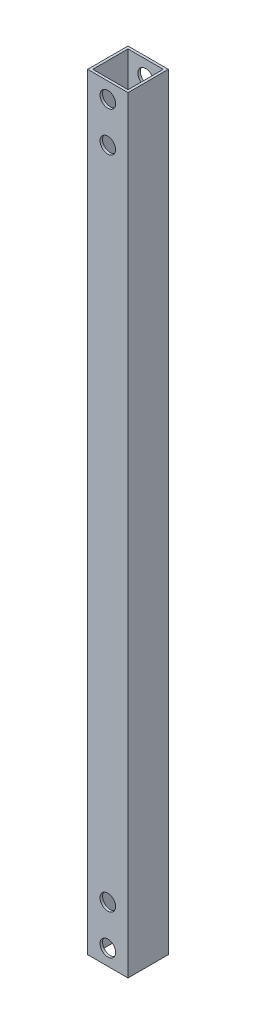
ISO-10303-21;
HEADER;
FILE_DESCRIPTION(('STEP AP214'),'2;1');
FILE_NAME('part.step','',(''),(''),'','','');
FILE_SCHEMA(('AUTOMOTIVE_DESIGN { 1 0 10303 214 1 1 1 1 }'));
ENDSEC;
DATA;
#1=APPLICATION_CONTEXT('core data for automotive mechanical design processes');
#2=APPLICATION_PROTOCOL_DEFINITION('international standard','automotive_design',2000,#1);
#3=PRODUCT_CONTEXT('',#1,'mechanical');
#4=PRODUCT('Part','Part','',(#3));
#5=PRODUCT_RELATED_PRODUCT_CATEGORY('part','',(#4));
#6=PRODUCT_DEFINITION_FORMATION('','',#4);
#7=PRODUCT_DEFINITION_CONTEXT('part definition',#1,'design');
#8=PRODUCT_DEFINITION('design','',#6,#7);
#9=PRODUCT_DEFINITION_SHAPE('','',#8);
#10=(LENGTH_UNIT() NAMED_UNIT(*) SI_UNIT(.MILLI.,.METRE.));
#11=(NAMED_UNIT(*) PLANE_ANGLE_UNIT() SI_UNIT($,.RADIAN.));
#12=(NAMED_UNIT(*) SI_UNIT($,.STERADIAN.) SOLID_ANGLE_UNIT());
#13=UNCERTAINTY_MEASURE_WITH_UNIT(LENGTH_MEASURE(1.E-05),#10,'distance_accuracy_value','');
#14=(GEOMETRIC_REPRESENTATION_CONTEXT(3) GLOBAL_UNCERTAINTY_ASSIGNED_CONTEXT((#13)) GLOBAL_UNIT_ASSIGNED_CONTEXT((#10,
#11,#12)) REPRESENTATION_CONTEXT('',''));
#15=CARTESIAN_POINT('',(0.,0.,0.));
#16=DIRECTION('',(0.,0.,1.));
#17=DIRECTION('',(1.,0.,0.));
#18=AXIS2_PLACEMENT_3D('',#15,#16,#17);
#19=CARTESIAN_POINT('',(0.,482.6,0.));
#20=DIRECTION('',(0.,1.,0.));
#21=DIRECTION('',(0.,0.,1.));
#22=AXIS2_PLACEMENT_3D('',#19,#20,#21);
#23=PLANE('',#22);
#24=DIRECTION('',(0.,0.,-1.));
#25=VECTOR('',#24,1.);
#26=CARTESIAN_POINT('',(12.7,482.6,12.7));
#27=LINE('',#26,#25);
#28=CARTESIAN_POINT('',(12.7,482.6,12.7));
#29=VERTEX_POINT('',#28);
#30=CARTESIAN_POINT('',(12.7,482.6,-12.7));
#31=VERTEX_POINT('',#30);
#32=EDGE_CURVE('E171',#29,#31,#27,.T.);
#33=ORIENTED_EDGE('',*,*,#32,.T.);
#34=DIRECTION('',(-1.,0.,0.));
#35=VECTOR('',#34,1.);
#36=CARTESIAN_POINT('',(-12.7,482.6,-12.7));
#37=LINE('',#36,#35);
#38=CARTESIAN_POINT('',(-12.7,482.6,-12.7));
#39=VERTEX_POINT('',#38);
#40=EDGE_CURVE('E174',#31,#39,#37,.T.);
#41=ORIENTED_EDGE('',*,*,#40,.T.);
#42=DIRECTION('',(0.,0.,1.));
#43=VECTOR('',#42,1.);
#44=CARTESIAN_POINT('',(-12.7,482.6,12.7));
#45=LINE('',#44,#43);
#46=CARTESIAN_POINT('',(-12.7,482.6,12.7));
#47=VERTEX_POINT('',#46);
#48=EDGE_CURVE('E177',#39,#47,#45,.T.);
#49=ORIENTED_EDGE('',*,*,#48,.T.);
#50=DIRECTION('',(1.,0.,0.));
#51=VECTOR('',#50,1.);
#52=CARTESIAN_POINT('',(-12.7,482.6,12.7));
#53=LINE('',#52,#51);
#54=EDGE_CURVE('E179',#47,#29,#53,.T.);
#55=ORIENTED_EDGE('',*,*,#54,.T.);
#56=EDGE_LOOP('',(#33,#41,#49,#55));
#57=FACE_BOUND('',#56,.T.);
#58=DIRECTION('',(-1.,0.,0.));
#59=VECTOR('',#58,1.);
#60=CARTESIAN_POINT('',(0.,482.6,-11.1125));
#61=LINE('',#60,#59);
#62=CARTESIAN_POINT('',(11.1125,482.6,-11.1125));
#63=VERTEX_POINT('',#62);
#64=CARTESIAN_POINT('',(-11.1125,482.6,-11.1125));
#65=VERTEX_POINT('',#64);
#66=EDGE_CURVE('E141',#63,#65,#61,.T.);
#67=ORIENTED_EDGE('',*,*,#66,.F.);
#68=DIRECTION('',(0.,0.,-1.));
#69=VECTOR('',#68,1.);
#70=CARTESIAN_POINT('',(11.1125,482.6,0.));
#71=LINE('',#70,#69);
#72=CARTESIAN_POINT('',(11.1125,482.6,11.1125));
#73=VERTEX_POINT('',#72);
#74=EDGE_CURVE('E133',#73,#63,#71,.T.);
#75=ORIENTED_EDGE('',*,*,#74,.F.);
#76=DIRECTION('',(1.,0.,0.));
#77=VECTOR('',#76,1.);
#78=CARTESIAN_POINT('',(0.,482.6,11.1125));
#79=LINE('',#78,#77);
#80=CARTESIAN_POINT('',(-11.1125,482.6,11.1125));
#81=VERTEX_POINT('',#80);
#82=EDGE_CURVE('E155',#81,#73,#79,.T.);
#83=ORIENTED_EDGE('',*,*,#82,.F.);
#84=DIRECTION('',(0.,0.,1.));
#85=VECTOR('',#84,1.);
#86=CARTESIAN_POINT('',(-11.1125,482.6,0.));
#87=LINE('',#86,#85);
#88=EDGE_CURVE('E153',#65,#81,#87,.T.);
#89=ORIENTED_EDGE('',*,*,#88,.F.);
#90=EDGE_LOOP('',(#67,#75,#83,#89));
#91=FACE_BOUND('',#90,.T.);
#92=ADVANCED_FACE('F66',(#57,#91),#23,.T.);
#93=CARTESIAN_POINT('',(0.,0.,0.));
#94=DIRECTION('',(0.,1.,0.));
#95=DIRECTION('',(0.,0.,1.));
#96=AXIS2_PLACEMENT_3D('',#93,#94,#95);
#97=PLANE('',#96);
#98=DIRECTION('',(0.,0.,-1.));
#99=VECTOR('',#98,1.);
#100=CARTESIAN_POINT('',(12.7,0.,12.7));
#101=LINE('',#100,#99);
#102=CARTESIAN_POINT('',(12.7,0.,12.7));
#103=VERTEX_POINT('',#102);
#104=CARTESIAN_POINT('',(12.7,0.,-12.7));
#105=VERTEX_POINT('',#104);
#106=EDGE_CURVE('E149',#103,#105,#101,.T.);
#107=ORIENTED_EDGE('',*,*,#106,.F.);
#108=DIRECTION('',(1.,0.,0.));
#109=VECTOR('',#108,1.);
#110=CARTESIAN_POINT('',(-12.7,0.,12.7));
#111=LINE('',#110,#109);
#112=CARTESIAN_POINT('',(-12.7,0.,12.7));
#113=VERTEX_POINT('',#112);
#114=EDGE_CURVE('E175',#113,#103,#111,.T.);
#115=ORIENTED_EDGE('',*,*,#114,.F.);
#116=DIRECTION('',(0.,0.,1.));
#117=VECTOR('',#116,1.);
#118=CARTESIAN_POINT('',(-12.7,0.,12.7));
#119=LINE('',#118,#117);
#120=CARTESIAN_POINT('',(-12.7,0.,-12.7));
#121=VERTEX_POINT('',#120);
#122=EDGE_CURVE('E186',#121,#113,#119,.T.);
#123=ORIENTED_EDGE('',*,*,#122,.F.);
#124=DIRECTION('',(-1.,0.,0.));
#125=VECTOR('',#124,1.);
#126=CARTESIAN_POINT('',(-12.7,0.,-12.7));
#127=LINE('',#126,#125);
#128=EDGE_CURVE('E184',#105,#121,#127,.T.);
#129=ORIENTED_EDGE('',*,*,#128,.F.);
#130=EDGE_LOOP('',(#107,#115,#123,#129));
#131=FACE_BOUND('',#130,.T.);
#132=DIRECTION('',(0.,0.,-1.));
#133=VECTOR('',#132,1.);
#134=CARTESIAN_POINT('',(11.1125,0.,0.));
#135=LINE('',#134,#133);
#136=CARTESIAN_POINT('',(11.1125,0.,11.1125));
#137=VERTEX_POINT('',#136);
#138=CARTESIAN_POINT('',(11.1125,0.,-11.1125));
#139=VERTEX_POINT('',#138);
#140=EDGE_CURVE('E91',#137,#139,#135,.T.);
#141=ORIENTED_EDGE('',*,*,#140,.T.);
#142=DIRECTION('',(-1.,0.,0.));
#143=VECTOR('',#142,1.);
#144=CARTESIAN_POINT('',(0.,0.,-11.1125));
#145=LINE('',#144,#143);
#146=CARTESIAN_POINT('',(-11.1125,0.,-11.1125));
#147=VERTEX_POINT('',#146);
#148=EDGE_CURVE('E148',#139,#147,#145,.T.);
#149=ORIENTED_EDGE('',*,*,#148,.T.);
#150=DIRECTION('',(0.,0.,1.));
#151=VECTOR('',#150,1.);
#152=CARTESIAN_POINT('',(-11.1125,0.,0.));
#153=LINE('',#152,#151);
#154=CARTESIAN_POINT('',(-11.1125,0.,11.1125));
#155=VERTEX_POINT('',#154);
#156=EDGE_CURVE('E163',#147,#155,#153,.T.);
#157=ORIENTED_EDGE('',*,*,#156,.T.);
#158=DIRECTION('',(1.,0.,0.));
#159=VECTOR('',#158,1.);
#160=CARTESIAN_POINT('',(0.,0.,11.1125));
#161=LINE('',#160,#159);
#162=EDGE_CURVE('E142',#155,#137,#161,.T.);
#163=ORIENTED_EDGE('',*,*,#162,.T.);
#164=EDGE_LOOP('',(#141,#149,#157,#163));
#165=FACE_BOUND('',#164,.T.);
#166=ADVANCED_FACE('F255',(#131,#165),#97,.F.);
#167=CARTESIAN_POINT('',(12.7,482.6,12.7));
#168=DIRECTION('',(-1.,0.,0.));
#169=DIRECTION('',(0.,0.,1.));
#170=AXIS2_PLACEMENT_3D('',#167,#168,#169);
#171=PLANE('',#170);
#172=ORIENTED_EDGE('',*,*,#106,.T.);
#173=DIRECTION('',(0.,-1.,0.));
#174=VECTOR('',#173,1.);
#175=CARTESIAN_POINT('',(12.7,482.6,-12.7));
#176=LINE('',#175,#174);
#177=EDGE_CURVE('E12',#31,#105,#176,.T.);
#178=ORIENTED_EDGE('',*,*,#177,.F.);
#179=ORIENTED_EDGE('',*,*,#32,.F.);
#180=DIRECTION('',(0.,-1.,0.));
#181=VECTOR('',#180,1.);
#182=CARTESIAN_POINT('',(12.7,482.6,12.7));
#183=LINE('',#182,#181);
#184=EDGE_CURVE('E181',#29,#103,#183,.T.);
#185=ORIENTED_EDGE('',*,*,#184,.T.);
#186=EDGE_LOOP('',(#172,#178,#179,#185));
#187=FACE_BOUND('',#186,.T.);
#188=ADVANCED_FACE('F68',(#187),#171,.F.);
#189=CARTESIAN_POINT('',(-12.7,482.6,-12.7));
#190=DIRECTION('',(0.,0.,1.));
#191=DIRECTION('',(1.,0.,0.));
#192=AXIS2_PLACEMENT_3D('',#189,#190,#191);
#193=PLANE('',#192);
#194=CARTESIAN_POINT('',(0.,472.6,-12.7));
#195=DIRECTION('',(0.,0.,-1.));
#196=DIRECTION('',(-1.,0.,0.));
#197=AXIS2_PLACEMENT_3D('',#194,#195,#196);
#198=CIRCLE('',#197,4.9022);
#199=CARTESIAN_POINT('',(-4.90219999999999,472.6,-12.7));
#200=VERTEX_POINT('',#199);
#201=EDGE_CURVE('E280',#200,#200,#198,.T.);
#202=ORIENTED_EDGE('',*,*,#201,.F.);
#203=EDGE_LOOP('',(#202));
#204=FACE_BOUND('',#203,.T.);
#205=CARTESIAN_POINT('',(0.,447.6,-12.7));
#206=DIRECTION('',(0.,0.,-1.));
#207=DIRECTION('',(-1.,0.,0.));
#208=AXIS2_PLACEMENT_3D('',#205,#206,#207);
#209=CIRCLE('',#208,4.9022);
#210=CARTESIAN_POINT('',(-4.9022,447.6,-12.7));
#211=VERTEX_POINT('',#210);
#212=EDGE_CURVE('E214',#211,#211,#209,.T.);
#213=ORIENTED_EDGE('',*,*,#212,.F.);
#214=EDGE_LOOP('',(#213));
#215=FACE_BOUND('',#214,.T.);
#216=CARTESIAN_POINT('',(0.,35.,-12.7));
#217=DIRECTION('',(0.,0.,-1.));
#218=DIRECTION('',(-1.,0.,0.));
#219=AXIS2_PLACEMENT_3D('',#216,#217,#218);
#220=CIRCLE('',#219,4.9022);
#221=CARTESIAN_POINT('',(-4.90220000000006,35.,-12.7));
#222=VERTEX_POINT('',#221);
#223=EDGE_CURVE('E211',#222,#222,#220,.T.);
#224=ORIENTED_EDGE('',*,*,#223,.F.);
#225=EDGE_LOOP('',(#224));
#226=FACE_BOUND('',#225,.T.);
#227=CARTESIAN_POINT('',(0.,10.,-12.7));
#228=DIRECTION('',(0.,0.,-1.));
#229=DIRECTION('',(-1.,0.,0.));
#230=AXIS2_PLACEMENT_3D('',#227,#228,#229);
#231=CIRCLE('',#230,4.9022);
#232=CARTESIAN_POINT('',(-4.90220000000006,10.,-12.7));
#233=VERTEX_POINT('',#232);
#234=EDGE_CURVE('E229',#233,#233,#231,.T.);
#235=ORIENTED_EDGE('',*,*,#234,.F.);
#236=EDGE_LOOP('',(#235));
#237=FACE_BOUND('',#236,.T.);
#238=ORIENTED_EDGE('',*,*,#128,.T.);
#239=DIRECTION('',(0.,-1.,0.));
#240=VECTOR('',#239,1.);
#241=CARTESIAN_POINT('',(-12.7,482.6,-12.7));
#242=LINE('',#241,#240);
#243=EDGE_CURVE('E75',#39,#121,#242,.T.);
#244=ORIENTED_EDGE('',*,*,#243,.F.);
#245=ORIENTED_EDGE('',*,*,#40,.F.);
#246=ORIENTED_EDGE('',*,*,#177,.T.);
#247=EDGE_LOOP('',(#238,#244,#245,#246));
#248=FACE_BOUND('',#247,.T.);
#249=ADVANCED_FACE('F269',(#204,#215,#226,#237,#248),#193,.F.);
#250=CARTESIAN_POINT('',(-12.7,482.6,12.7));
#251=DIRECTION('',(1.,0.,0.));
#252=DIRECTION('',(0.,0.,-1.));
#253=AXIS2_PLACEMENT_3D('',#250,#251,#252);
#254=PLANE('',#253);
#255=ORIENTED_EDGE('',*,*,#122,.T.);
#256=DIRECTION('',(0.,-1.,0.));
#257=VECTOR('',#256,1.);
#258=CARTESIAN_POINT('',(-12.7,482.6,12.7));
#259=LINE('',#258,#257);
#260=EDGE_CURVE('E191',#47,#113,#259,.T.);
#261=ORIENTED_EDGE('',*,*,#260,.F.);
#262=ORIENTED_EDGE('',*,*,#48,.F.);
#263=ORIENTED_EDGE('',*,*,#243,.T.);
#264=EDGE_LOOP('',(#255,#261,#262,#263));
#265=FACE_BOUND('',#264,.T.);
#266=ADVANCED_FACE('F266',(#265),#254,.F.);
#267=CARTESIAN_POINT('',(-12.7,482.6,12.7));
#268=DIRECTION('',(0.,0.,-1.));
#269=DIRECTION('',(-1.,0.,0.));
#270=AXIS2_PLACEMENT_3D('',#267,#268,#269);
#271=PLANE('',#270);
#272=CARTESIAN_POINT('',(0.,472.6,12.7));
#273=DIRECTION('',(0.,0.,-1.));
#274=DIRECTION('',(-1.,0.,0.));
#275=AXIS2_PLACEMENT_3D('',#272,#273,#274);
#276=CIRCLE('',#275,4.90219999999999);
#277=CARTESIAN_POINT('',(-4.90219999999999,472.6,12.7));
#278=VERTEX_POINT('',#277);
#279=EDGE_CURVE('E333',#278,#278,#276,.T.);
#280=ORIENTED_EDGE('',*,*,#279,.T.);
#281=EDGE_LOOP('',(#280));
#282=FACE_BOUND('',#281,.T.);
#283=CARTESIAN_POINT('',(0.,447.6,12.7));
#284=DIRECTION('',(0.,0.,-1.));
#285=DIRECTION('',(-1.,0.,0.));
#286=AXIS2_PLACEMENT_3D('',#283,#284,#285);
#287=CIRCLE('',#286,4.90219999999999);
#288=CARTESIAN_POINT('',(-4.90219999999999,447.6,12.7));
#289=VERTEX_POINT('',#288);
#290=EDGE_CURVE('E207',#289,#289,#287,.T.);
#291=ORIENTED_EDGE('',*,*,#290,.T.);
#292=EDGE_LOOP('',(#291));
#293=FACE_BOUND('',#292,.T.);
#294=CARTESIAN_POINT('',(0.,35.,12.7));
#295=DIRECTION('',(0.,0.,-1.));
#296=DIRECTION('',(-1.,0.,0.));
#297=AXIS2_PLACEMENT_3D('',#294,#295,#296);
#298=CIRCLE('',#297,4.90219999999999);
#299=CARTESIAN_POINT('',(-4.90220000000005,35.,12.7));
#300=VERTEX_POINT('',#299);
#301=EDGE_CURVE('E203',#300,#300,#298,.T.);
#302=ORIENTED_EDGE('',*,*,#301,.T.);
#303=EDGE_LOOP('',(#302));
#304=FACE_BOUND('',#303,.T.);
#305=CARTESIAN_POINT('',(0.,10.,12.7));
#306=DIRECTION('',(0.,0.,-1.));
#307=DIRECTION('',(-1.,0.,0.));
#308=AXIS2_PLACEMENT_3D('',#305,#306,#307);
#309=CIRCLE('',#308,4.90219999999999);
#310=CARTESIAN_POINT('',(-4.90220000000006,10.,12.7));
#311=VERTEX_POINT('',#310);
#312=EDGE_CURVE('E199',#311,#311,#309,.T.);
#313=ORIENTED_EDGE('',*,*,#312,.T.);
#314=EDGE_LOOP('',(#313));
#315=FACE_BOUND('',#314,.T.);
#316=ORIENTED_EDGE('',*,*,#114,.T.);
#317=ORIENTED_EDGE('',*,*,#184,.F.);
#318=ORIENTED_EDGE('',*,*,#54,.F.);
#319=ORIENTED_EDGE('',*,*,#260,.T.);
#320=EDGE_LOOP('',(#316,#317,#318,#319));
#321=FACE_BOUND('',#320,.T.);
#322=ADVANCED_FACE('F250',(#282,#293,#304,#315,#321),#271,.F.);
#323=CARTESIAN_POINT('',(11.1125,482.6,0.));
#324=DIRECTION('',(-1.,0.,0.));
#325=DIRECTION('',(0.,0.,1.));
#326=AXIS2_PLACEMENT_3D('',#323,#324,#325);
#327=PLANE('',#326);
#328=ORIENTED_EDGE('',*,*,#140,.F.);
#329=DIRECTION('',(0.,-1.,0.));
#330=VECTOR('',#329,1.);
#331=CARTESIAN_POINT('',(11.1125,482.6,11.1125));
#332=LINE('',#331,#330);
#333=EDGE_CURVE('E137',#73,#137,#332,.T.);
#334=ORIENTED_EDGE('',*,*,#333,.F.);
#335=ORIENTED_EDGE('',*,*,#74,.T.);
#336=DIRECTION('',(0.,-1.,0.));
#337=VECTOR('',#336,1.);
#338=CARTESIAN_POINT('',(11.1125,482.6,-11.1125));
#339=LINE('',#338,#337);
#340=EDGE_CURVE('E136',#63,#139,#339,.T.);
#341=ORIENTED_EDGE('',*,*,#340,.T.);
#342=EDGE_LOOP('',(#328,#334,#335,#341));
#343=FACE_BOUND('',#342,.T.);
#344=ADVANCED_FACE('F135',(#343),#327,.T.);
#345=CARTESIAN_POINT('',(0.,482.6,-11.1125));
#346=DIRECTION('',(0.,0.,1.));
#347=DIRECTION('',(1.,0.,0.));
#348=AXIS2_PLACEMENT_3D('',#345,#346,#347);
#349=PLANE('',#348);
#350=CARTESIAN_POINT('',(0.,472.6,-11.1125));
#351=DIRECTION('',(0.,0.,1.));
#352=DIRECTION('',(1.,0.,0.));
#353=AXIS2_PLACEMENT_3D('',#350,#351,#352);
#354=CIRCLE('',#353,4.9022);
#355=CARTESIAN_POINT('',(4.9022,472.6,-11.1125));
#356=VERTEX_POINT('',#355);
#357=EDGE_CURVE('E70',#356,#356,#354,.T.);
#358=ORIENTED_EDGE('',*,*,#357,.F.);
#359=EDGE_LOOP('',(#358));
#360=FACE_BOUND('',#359,.T.);
#361=CARTESIAN_POINT('',(0.,447.6,-11.1125));
#362=DIRECTION('',(0.,0.,1.));
#363=DIRECTION('',(1.,0.,0.));
#364=AXIS2_PLACEMENT_3D('',#361,#362,#363);
#365=CIRCLE('',#364,4.9022);
#366=CARTESIAN_POINT('',(4.9022,447.6,-11.1125));
#367=VERTEX_POINT('',#366);
#368=EDGE_CURVE('E206',#367,#367,#365,.T.);
#369=ORIENTED_EDGE('',*,*,#368,.F.);
#370=EDGE_LOOP('',(#369));
#371=FACE_BOUND('',#370,.T.);
#372=CARTESIAN_POINT('',(0.,35.,-11.1125));
#373=DIRECTION('',(0.,0.,1.));
#374=DIRECTION('',(1.,0.,0.));
#375=AXIS2_PLACEMENT_3D('',#372,#373,#374);
#376=CIRCLE('',#375,4.9022);
#377=CARTESIAN_POINT('',(4.90219999999993,35.,-11.1125));
#378=VERTEX_POINT('',#377);
#379=EDGE_CURVE('E202',#378,#378,#376,.T.);
#380=ORIENTED_EDGE('',*,*,#379,.F.);
#381=EDGE_LOOP('',(#380));
#382=FACE_BOUND('',#381,.T.);
#383=CARTESIAN_POINT('',(0.,10.,-11.1125));
#384=DIRECTION('',(0.,0.,1.));
#385=DIRECTION('',(1.,0.,0.));
#386=AXIS2_PLACEMENT_3D('',#383,#384,#385);
#387=CIRCLE('',#386,4.9022);
#388=CARTESIAN_POINT('',(4.90219999999993,10.,-11.1125));
#389=VERTEX_POINT('',#388);
#390=EDGE_CURVE('E161',#389,#389,#387,.T.);
#391=ORIENTED_EDGE('',*,*,#390,.F.);
#392=EDGE_LOOP('',(#391));
#393=FACE_BOUND('',#392,.T.);
#394=ORIENTED_EDGE('',*,*,#148,.F.);
#395=ORIENTED_EDGE('',*,*,#340,.F.);
#396=ORIENTED_EDGE('',*,*,#66,.T.);
#397=DIRECTION('',(0.,-1.,0.));
#398=VECTOR('',#397,1.);
#399=CARTESIAN_POINT('',(-11.1125,482.6,-11.1125));
#400=LINE('',#399,#398);
#401=EDGE_CURVE('E150',#65,#147,#400,.T.);
#402=ORIENTED_EDGE('',*,*,#401,.T.);
#403=EDGE_LOOP('',(#394,#395,#396,#402));
#404=FACE_BOUND('',#403,.T.);
#405=ADVANCED_FACE('F145',(#360,#371,#382,#393,#404),#349,.T.);
#406=CARTESIAN_POINT('',(-11.1125,482.6,0.));
#407=DIRECTION('',(1.,0.,0.));
#408=DIRECTION('',(0.,0.,-1.));
#409=AXIS2_PLACEMENT_3D('',#406,#407,#408);
#410=PLANE('',#409);
#411=ORIENTED_EDGE('',*,*,#156,.F.);
#412=ORIENTED_EDGE('',*,*,#401,.F.);
#413=ORIENTED_EDGE('',*,*,#88,.T.);
#414=DIRECTION('',(0.,-1.,0.));
#415=VECTOR('',#414,1.);
#416=CARTESIAN_POINT('',(-11.1125,482.6,11.1125));
#417=LINE('',#416,#415);
#418=EDGE_CURVE('E83',#81,#155,#417,.T.);
#419=ORIENTED_EDGE('',*,*,#418,.T.);
#420=EDGE_LOOP('',(#411,#412,#413,#419));
#421=FACE_BOUND('',#420,.T.);
#422=ADVANCED_FACE('F240',(#421),#410,.T.);
#423=CARTESIAN_POINT('',(0.,482.6,11.1125));
#424=DIRECTION('',(0.,0.,-1.));
#425=DIRECTION('',(-1.,0.,0.));
#426=AXIS2_PLACEMENT_3D('',#423,#424,#425);
#427=PLANE('',#426);
#428=CARTESIAN_POINT('',(0.,472.6,11.1125));
#429=DIRECTION('',(0.,0.,-1.));
#430=DIRECTION('',(-1.,0.,0.));
#431=AXIS2_PLACEMENT_3D('',#428,#429,#430);
#432=CIRCLE('',#431,4.9022);
#433=CARTESIAN_POINT('',(-4.90219999999999,472.6,11.1125));
#434=VERTEX_POINT('',#433);
#435=EDGE_CURVE('E219',#434,#434,#432,.T.);
#436=ORIENTED_EDGE('',*,*,#435,.F.);
#437=EDGE_LOOP('',(#436));
#438=FACE_BOUND('',#437,.T.);
#439=CARTESIAN_POINT('',(0.,447.6,11.1125));
#440=DIRECTION('',(0.,0.,-1.));
#441=DIRECTION('',(-1.,0.,0.));
#442=AXIS2_PLACEMENT_3D('',#439,#440,#441);
#443=CIRCLE('',#442,4.9022);
#444=CARTESIAN_POINT('',(-4.90219999999999,447.6,11.1125));
#445=VERTEX_POINT('',#444);
#446=EDGE_CURVE('E204',#445,#445,#443,.T.);
#447=ORIENTED_EDGE('',*,*,#446,.F.);
#448=EDGE_LOOP('',(#447));
#449=FACE_BOUND('',#448,.T.);
#450=CARTESIAN_POINT('',(0.,35.,11.1125));
#451=DIRECTION('',(0.,0.,-1.));
#452=DIRECTION('',(-1.,0.,0.));
#453=AXIS2_PLACEMENT_3D('',#450,#451,#452);
#454=CIRCLE('',#453,4.9022);
#455=CARTESIAN_POINT('',(-4.90220000000006,35.,11.1125));
#456=VERTEX_POINT('',#455);
#457=EDGE_CURVE('E200',#456,#456,#454,.T.);
#458=ORIENTED_EDGE('',*,*,#457,.F.);
#459=EDGE_LOOP('',(#458));
#460=FACE_BOUND('',#459,.T.);
#461=CARTESIAN_POINT('',(0.,10.,11.1125));
#462=DIRECTION('',(0.,0.,-1.));
#463=DIRECTION('',(-1.,0.,0.));
#464=AXIS2_PLACEMENT_3D('',#461,#462,#463);
#465=CIRCLE('',#464,4.9022);
#466=CARTESIAN_POINT('',(-4.90220000000006,10.,11.1125));
#467=VERTEX_POINT('',#466);
#468=EDGE_CURVE('E196',#467,#467,#465,.T.);
#469=ORIENTED_EDGE('',*,*,#468,.F.);
#470=EDGE_LOOP('',(#469));
#471=FACE_BOUND('',#470,.T.);
#472=ORIENTED_EDGE('',*,*,#162,.F.);
#473=ORIENTED_EDGE('',*,*,#418,.F.);
#474=ORIENTED_EDGE('',*,*,#82,.T.);
#475=ORIENTED_EDGE('',*,*,#333,.T.);
#476=EDGE_LOOP('',(#472,#473,#474,#475));
#477=FACE_BOUND('',#476,.T.);
#478=ADVANCED_FACE('F247',(#438,#449,#460,#471,#477),#427,.T.);
#479=CARTESIAN_POINT('',(0.,10.,-12.7));
#480=DIRECTION('',(0.,0.,-1.));
#481=DIRECTION('',(-1.,0.,0.));
#482=AXIS2_PLACEMENT_3D('',#479,#480,#481);
#483=CYLINDRICAL_SURFACE('',#482,4.9022);
#484=ORIENTED_EDGE('',*,*,#468,.T.);
#485=EDGE_LOOP('',(#484));
#486=FACE_BOUND('',#485,.T.);
#487=ORIENTED_EDGE('',*,*,#312,.F.);
#488=EDGE_LOOP('',(#487));
#489=FACE_BOUND('',#488,.T.);
#490=ADVANCED_FACE('F301',(#486,#489),#483,.F.);
#491=ORIENTED_EDGE('',*,*,#390,.T.);
#492=EDGE_LOOP('',(#491));
#493=FACE_BOUND('',#492,.T.);
#494=ORIENTED_EDGE('',*,*,#234,.T.);
#495=EDGE_LOOP('',(#494));
#496=FACE_BOUND('',#495,.T.);
#497=ADVANCED_FACE('F236',(#493,#496),#483,.F.);
#498=CARTESIAN_POINT('',(0.,35.,-12.7));
#499=DIRECTION('',(0.,0.,-1.));
#500=DIRECTION('',(-1.,0.,0.));
#501=AXIS2_PLACEMENT_3D('',#498,#499,#500);
#502=CYLINDRICAL_SURFACE('',#501,4.9022);
#503=ORIENTED_EDGE('',*,*,#457,.T.);
#504=EDGE_LOOP('',(#503));
#505=FACE_BOUND('',#504,.T.);
#506=ORIENTED_EDGE('',*,*,#301,.F.);
#507=EDGE_LOOP('',(#506));
#508=FACE_BOUND('',#507,.T.);
#509=ADVANCED_FACE('F312',(#505,#508),#502,.F.);
#510=ORIENTED_EDGE('',*,*,#379,.T.);
#511=EDGE_LOOP('',(#510));
#512=FACE_BOUND('',#511,.T.);
#513=ORIENTED_EDGE('',*,*,#223,.T.);
#514=EDGE_LOOP('',(#513));
#515=FACE_BOUND('',#514,.T.);
#516=ADVANCED_FACE('F315',(#512,#515),#502,.F.);
#517=CARTESIAN_POINT('',(0.,447.6,-12.7));
#518=DIRECTION('',(0.,0.,-1.));
#519=DIRECTION('',(-1.,0.,0.));
#520=AXIS2_PLACEMENT_3D('',#517,#518,#519);
#521=CYLINDRICAL_SURFACE('',#520,4.9022);
#522=ORIENTED_EDGE('',*,*,#446,.T.);
#523=EDGE_LOOP('',(#522));
#524=FACE_BOUND('',#523,.T.);
#525=ORIENTED_EDGE('',*,*,#290,.F.);
#526=EDGE_LOOP('',(#525));
#527=FACE_BOUND('',#526,.T.);
#528=ADVANCED_FACE('F317',(#524,#527),#521,.F.);
#529=ORIENTED_EDGE('',*,*,#368,.T.);
#530=EDGE_LOOP('',(#529));
#531=FACE_BOUND('',#530,.T.);
#532=ORIENTED_EDGE('',*,*,#212,.T.);
#533=EDGE_LOOP('',(#532));
#534=FACE_BOUND('',#533,.T.);
#535=ADVANCED_FACE('F320',(#531,#534),#521,.F.);
#536=CARTESIAN_POINT('',(0.,472.6,-12.7));
#537=DIRECTION('',(0.,0.,-1.));
#538=DIRECTION('',(-1.,0.,0.));
#539=AXIS2_PLACEMENT_3D('',#536,#537,#538);
#540=CYLINDRICAL_SURFACE('',#539,4.9022);
#541=ORIENTED_EDGE('',*,*,#357,.T.);
#542=EDGE_LOOP('',(#541));
#543=FACE_BOUND('',#542,.T.);
#544=ORIENTED_EDGE('',*,*,#201,.T.);
#545=EDGE_LOOP('',(#544));
#546=FACE_BOUND('',#545,.T.);
#547=ADVANCED_FACE('F321',(#543,#546),#540,.F.);
#548=ORIENTED_EDGE('',*,*,#435,.T.);
#549=EDGE_LOOP('',(#548));
#550=FACE_BOUND('',#549,.T.);
#551=ORIENTED_EDGE('',*,*,#279,.F.);
#552=EDGE_LOOP('',(#551));
#553=FACE_BOUND('',#552,.T.);
#554=ADVANCED_FACE('F323',(#550,#553),#540,.F.);
#555=CLOSED_SHELL('',(#92,#166,#188,#249,#266,#322,#344,#405,#422,#478,#490,#497,#509,#516,#528,
#535,#547,#554));
#556=MANIFOLD_SOLID_BREP('B2',#555);
#557=ADVANCED_BREP_SHAPE_REPRESENTATION('',(#18,#556),#14);
#558=SHAPE_DEFINITION_REPRESENTATION(#9,#557);
ENDSEC;
END-ISO-10303-21;
